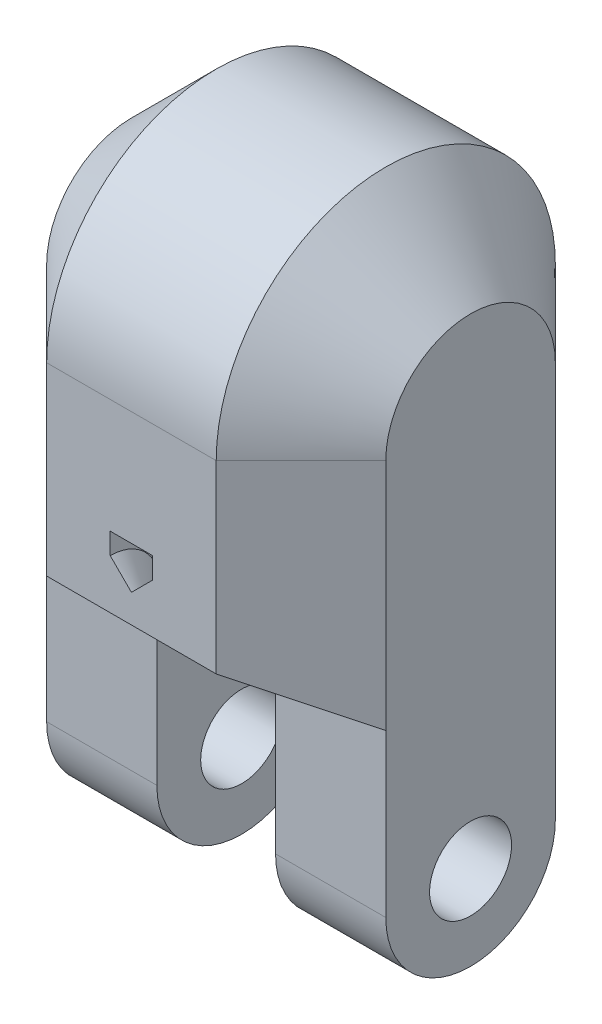
ISO-10303-21;
HEADER;
FILE_DESCRIPTION(('STEP AP214'),'2;1');
FILE_NAME('part.step','',(''),(''),'','','');
FILE_SCHEMA(('AUTOMOTIVE_DESIGN { 1 0 10303 214 1 1 1 1 }'));
ENDSEC;
DATA;
#1=APPLICATION_CONTEXT('core data for automotive mechanical design processes');
#2=APPLICATION_PROTOCOL_DEFINITION('international standard','automotive_design',2000,#1);
#3=PRODUCT_CONTEXT('',#1,'mechanical');
#4=PRODUCT('Part','Part','',(#3));
#5=PRODUCT_RELATED_PRODUCT_CATEGORY('part','',(#4));
#6=PRODUCT_DEFINITION_FORMATION('','',#4);
#7=PRODUCT_DEFINITION_CONTEXT('part definition',#1,'design');
#8=PRODUCT_DEFINITION('design','',#6,#7);
#9=PRODUCT_DEFINITION_SHAPE('','',#8);
#10=(LENGTH_UNIT() NAMED_UNIT(*) SI_UNIT(.MILLI.,.METRE.));
#11=(NAMED_UNIT(*) PLANE_ANGLE_UNIT() SI_UNIT($,.RADIAN.));
#12=(NAMED_UNIT(*) SI_UNIT($,.STERADIAN.) SOLID_ANGLE_UNIT());
#13=UNCERTAINTY_MEASURE_WITH_UNIT(LENGTH_MEASURE(1.E-05),#10,'distance_accuracy_value','');
#14=(GEOMETRIC_REPRESENTATION_CONTEXT(3) GLOBAL_UNCERTAINTY_ASSIGNED_CONTEXT((#13)) GLOBAL_UNIT_ASSIGNED_CONTEXT((#10,
#11,#12)) REPRESENTATION_CONTEXT('',''));
#15=CARTESIAN_POINT('',(0.,0.,0.));
#16=DIRECTION('',(0.,0.,1.));
#17=DIRECTION('',(1.,0.,0.));
#18=AXIS2_PLACEMENT_3D('',#15,#16,#17);
#19=CARTESIAN_POINT('',(-3.,5.,-6.));
#20=DIRECTION('',(0.,0.,-1.));
#21=DIRECTION('',(-1.,0.,0.));
#22=AXIS2_PLACEMENT_3D('',#19,#20,#21);
#23=PLANE('',#22);
#24=DIRECTION('',(0.,-1.,0.));
#25=VECTOR('',#24,1.);
#26=CARTESIAN_POINT('',(3.,5.,-6.));
#27=LINE('',#26,#25);
#28=CARTESIAN_POINT('',(3.,5.,-6.));
#29=VERTEX_POINT('',#28);
#30=CARTESIAN_POINT('',(3.,-8.7,-6.));
#31=VERTEX_POINT('',#30);
#32=EDGE_CURVE('E287',#29,#31,#27,.T.);
#33=ORIENTED_EDGE('',*,*,#32,.T.);
#34=DIRECTION('',(1.,0.,0.));
#35=VECTOR('',#34,1.);
#36=CARTESIAN_POINT('',(3.,-8.7,-6.));
#37=LINE('',#36,#35);
#38=CARTESIAN_POINT('',(-3.,-8.7,-6.));
#39=VERTEX_POINT('',#38);
#40=EDGE_CURVE('E492',#39,#31,#37,.T.);
#41=ORIENTED_EDGE('',*,*,#40,.F.);
#42=DIRECTION('',(0.,-1.,0.));
#43=VECTOR('',#42,1.);
#44=CARTESIAN_POINT('',(-3.,5.,-6.));
#45=LINE('',#44,#43);
#46=CARTESIAN_POINT('',(-3.,5.,-6.));
#47=VERTEX_POINT('',#46);
#48=EDGE_CURVE('E283',#47,#39,#45,.T.);
#49=ORIENTED_EDGE('',*,*,#48,.F.);
#50=DIRECTION('',(1.,0.,0.));
#51=VECTOR('',#50,1.);
#52=CARTESIAN_POINT('',(-3.,5.,-6.));
#53=LINE('',#52,#51);
#54=EDGE_CURVE('E321',#47,#29,#53,.T.);
#55=ORIENTED_EDGE('',*,*,#54,.T.);
#56=EDGE_LOOP('',(#33,#41,#49,#55));
#57=FACE_BOUND('',#56,.T.);
#58=DIRECTION('',(0.,1.,0.));
#59=VECTOR('',#58,1.);
#60=CARTESIAN_POINT('',(0.75,5.,-6.));
#61=LINE('',#60,#59);
#62=CARTESIAN_POINT('',(0.749999999999999,-7.7,-6.));
#63=VERTEX_POINT('',#62);
#64=CARTESIAN_POINT('',(0.75,-6.95,-6.));
#65=VERTEX_POINT('',#64);
#66=EDGE_CURVE('E513',#63,#65,#61,.T.);
#67=ORIENTED_EDGE('',*,*,#66,.T.);
#68=DIRECTION('',(0.707106781186548,-0.707106781186547,0.));
#69=VECTOR('',#68,1.);
#70=CARTESIAN_POINT('',(2.5,-8.7,-6.));
#71=LINE('',#70,#69);
#72=CARTESIAN_POINT('',(0.,-6.2,-6.));
#73=VERTEX_POINT('',#72);
#74=EDGE_CURVE('E223',#65,#73,#71,.F.);
#75=ORIENTED_EDGE('',*,*,#74,.T.);
#76=DIRECTION('',(0.707106781186547,0.707106781186548,0.));
#77=VECTOR('',#76,1.);
#78=CARTESIAN_POINT('',(-2.5,-8.7,-6.));
#79=LINE('',#78,#77);
#80=CARTESIAN_POINT('',(-0.75,-6.95,-6.));
#81=VERTEX_POINT('',#80);
#82=EDGE_CURVE('E501',#73,#81,#79,.F.);
#83=ORIENTED_EDGE('',*,*,#82,.T.);
#84=DIRECTION('',(0.,-1.,0.));
#85=VECTOR('',#84,1.);
#86=CARTESIAN_POINT('',(-0.75,5.,-6.));
#87=LINE('',#86,#85);
#88=CARTESIAN_POINT('',(-0.750000000000001,-7.7,-6.));
#89=VERTEX_POINT('',#88);
#90=EDGE_CURVE('E505',#81,#89,#87,.T.);
#91=ORIENTED_EDGE('',*,*,#90,.T.);
#92=DIRECTION('',(-1.,0.,0.));
#93=VECTOR('',#92,1.);
#94=CARTESIAN_POINT('',(-3.,-7.7,-6.));
#95=LINE('',#94,#93);
#96=EDGE_CURVE('E509',#89,#63,#95,.F.);
#97=ORIENTED_EDGE('',*,*,#96,.T.);
#98=EDGE_LOOP('',(#67,#75,#83,#91,#97));
#99=FACE_BOUND('',#98,.T.);
#100=ADVANCED_FACE('F39',(#57,#99),#23,.T.);
#101=CARTESIAN_POINT('',(0.,-8.7,0.));
#102=DIRECTION('',(0.,-1.,0.));
#103=DIRECTION('',(0.,0.,-1.));
#104=AXIS2_PLACEMENT_3D('',#101,#102,#103);
#105=PLANE('',#104);
#106=DIRECTION('',(0.707106781186548,0.,-0.707106781186548));
#107=VECTOR('',#106,1.);
#108=CARTESIAN_POINT('',(-3.,-8.7,-6.));
#109=LINE('',#108,#107);
#110=CARTESIAN_POINT('',(-6.,-8.7,-3.));
#111=VERTEX_POINT('',#110);
#112=EDGE_CURVE('E482',#111,#39,#109,.T.);
#113=ORIENTED_EDGE('',*,*,#112,.T.);
#114=ORIENTED_EDGE('',*,*,#40,.T.);
#115=DIRECTION('',(0.707106781186548,0.,0.707106781186548));
#116=VECTOR('',#115,1.);
#117=CARTESIAN_POINT('',(6.,-8.7,-3.));
#118=LINE('',#117,#116);
#119=CARTESIAN_POINT('',(6.,-8.7,-3.));
#120=VERTEX_POINT('',#119);
#121=EDGE_CURVE('E488',#31,#120,#118,.T.);
#122=ORIENTED_EDGE('',*,*,#121,.T.);
#123=DIRECTION('',(-1.,0.,0.));
#124=VECTOR('',#123,1.);
#125=CARTESIAN_POINT('',(2.1,-8.7,-3.));
#126=LINE('',#125,#124);
#127=CARTESIAN_POINT('',(2.1,-8.7,-3.));
#128=VERTEX_POINT('',#127);
#129=EDGE_CURVE('E477',#120,#128,#126,.T.);
#130=ORIENTED_EDGE('',*,*,#129,.T.);
#131=CARTESIAN_POINT('',(-2.1,-8.7,-3.));
#132=VERTEX_POINT('',#131);
#133=EDGE_CURVE('E486',#128,#132,#126,.T.);
#134=ORIENTED_EDGE('',*,*,#133,.T.);
#135=EDGE_CURVE('E487',#132,#111,#126,.T.);
#136=ORIENTED_EDGE('',*,*,#135,.T.);
#137=EDGE_LOOP('',(#113,#114,#122,#130,#134,#136));
#138=FACE_BOUND('',#137,.T.);
#139=DIRECTION('',(-0.707106781186547,0.,-0.707106781186548));
#140=VECTOR('',#139,1.);
#141=CARTESIAN_POINT('',(-2.5,-8.7,-6.));
#142=LINE('',#141,#140);
#143=CARTESIAN_POINT('',(-0.75,-8.7,-4.25));
#144=VERTEX_POINT('',#143);
#145=CARTESIAN_POINT('',(0.,-8.7,-3.5));
#146=VERTEX_POINT('',#145);
#147=EDGE_CURVE('E48',#144,#146,#142,.F.);
#148=ORIENTED_EDGE('',*,*,#147,.T.);
#149=DIRECTION('',(-0.707106781186548,0.,0.707106781186547));
#150=VECTOR('',#149,1.);
#151=CARTESIAN_POINT('',(2.5,-8.7,-6.));
#152=LINE('',#151,#150);
#153=CARTESIAN_POINT('',(0.75,-8.7,-4.25));
#154=VERTEX_POINT('',#153);
#155=EDGE_CURVE('E11',#146,#154,#152,.F.);
#156=ORIENTED_EDGE('',*,*,#155,.T.);
#157=DIRECTION('',(0.,0.,-1.));
#158=VECTOR('',#157,1.);
#159=CARTESIAN_POINT('',(0.75,-8.7,0.));
#160=LINE('',#159,#158);
#161=CARTESIAN_POINT('',(0.749999999999999,-8.7,-5.));
#162=VERTEX_POINT('',#161);
#163=EDGE_CURVE('E210',#154,#162,#160,.T.);
#164=ORIENTED_EDGE('',*,*,#163,.T.);
#165=DIRECTION('',(-1.,0.,0.));
#166=VECTOR('',#165,1.);
#167=CARTESIAN_POINT('',(-3.,-8.7,-5.));
#168=LINE('',#167,#166);
#169=CARTESIAN_POINT('',(-0.750000000000001,-8.7,-5.));
#170=VERTEX_POINT('',#169);
#171=EDGE_CURVE('E215',#162,#170,#168,.T.);
#172=ORIENTED_EDGE('',*,*,#171,.T.);
#173=DIRECTION('',(0.,0.,1.));
#174=VECTOR('',#173,1.);
#175=CARTESIAN_POINT('',(-0.75,-8.7,0.));
#176=LINE('',#175,#174);
#177=EDGE_CURVE('E230',#170,#144,#176,.T.);
#178=ORIENTED_EDGE('',*,*,#177,.T.);
#179=EDGE_LOOP('',(#148,#156,#164,#172,#178));
#180=FACE_BOUND('',#179,.T.);
#181=ADVANCED_FACE('F228',(#138,#180),#105,.T.);
#182=CARTESIAN_POINT('',(0.,-5.,0.));
#183=DIRECTION('',(0.,-1.,0.));
#184=DIRECTION('',(0.,0.,-1.));
#185=AXIS2_PLACEMENT_3D('',#182,#183,#184);
#186=PLANE('',#185);
#187=DIRECTION('',(0.,0.,-1.));
#188=VECTOR('',#187,1.);
#189=CARTESIAN_POINT('',(-2.1,-5.,0.));
#190=LINE('',#189,#188);
#191=CARTESIAN_POINT('',(-2.1,-5.,0.));
#192=VERTEX_POINT('',#191);
#193=CARTESIAN_POINT('',(-2.1,-5.,-3.));
#194=VERTEX_POINT('',#193);
#195=EDGE_CURVE('E356',#192,#194,#190,.T.);
#196=ORIENTED_EDGE('',*,*,#195,.T.);
#197=DIRECTION('',(-1.,0.,0.));
#198=VECTOR('',#197,1.);
#199=CARTESIAN_POINT('',(-6.,-5.,-3.));
#200=LINE('',#199,#198);
#201=CARTESIAN_POINT('',(2.1,-5.,-3.));
#202=VERTEX_POINT('',#201);
#203=EDGE_CURVE('E478',#202,#194,#200,.T.);
#204=ORIENTED_EDGE('',*,*,#203,.F.);
#205=DIRECTION('',(0.,0.,-1.));
#206=VECTOR('',#205,1.);
#207=CARTESIAN_POINT('',(2.1,-5.,0.));
#208=LINE('',#207,#206);
#209=CARTESIAN_POINT('',(2.1,-5.,0.));
#210=VERTEX_POINT('',#209);
#211=EDGE_CURVE('E271',#210,#202,#208,.T.);
#212=ORIENTED_EDGE('',*,*,#211,.F.);
#213=DIRECTION('',(1.,0.,0.));
#214=VECTOR('',#213,1.);
#215=CARTESIAN_POINT('',(-6.,-5.,0.));
#216=LINE('',#215,#214);
#217=EDGE_CURVE('E336',#192,#210,#216,.T.);
#218=ORIENTED_EDGE('',*,*,#217,.F.);
#219=EDGE_LOOP('',(#196,#204,#212,#218));
#220=FACE_BOUND('',#219,.T.);
#221=ADVANCED_FACE('F549',(#220),#186,.T.);
#222=CARTESIAN_POINT('',(-6.,-1.53589838486229,6.));
#223=DIRECTION('',(0.,0.866025403784442,-0.499999999999995));
#224=DIRECTION('',(0.,0.499999999999995,0.866025403784442));
#225=AXIS2_PLACEMENT_3D('',#222,#223,#224);
#226=PLANE('',#225);
#227=DIRECTION('',(-0.707106781186541,-0.353553390593273,-0.612372435695802));
#228=VECTOR('',#227,1.);
#229=CARTESIAN_POINT('',(0.999999999999979,-1.53589838486229,6.));
#230=LINE('',#229,#228);
#231=CARTESIAN_POINT('',(-0.749999999999986,-2.41089838486228,4.48445554337723));
#232=VERTEX_POINT('',#231);
#233=CARTESIAN_POINT('',(0.,-2.03589838486229,5.13397459621556));
#234=VERTEX_POINT('',#233);
#235=EDGE_CURVE('E438',#232,#234,#230,.F.);
#236=ORIENTED_EDGE('',*,*,#235,.T.);
#237=DIRECTION('',(-0.707106781186554,0.353553390593267,0.612372435695791));
#238=VECTOR('',#237,1.);
#239=CARTESIAN_POINT('',(-1.00000000000002,-1.53589838486229,6.));
#240=LINE('',#239,#238);
#241=CARTESIAN_POINT('',(0.750000000000014,-2.41089838486228,4.48445554337723));
#242=VERTEX_POINT('',#241);
#243=EDGE_CURVE('E261',#234,#242,#240,.F.);
#244=ORIENTED_EDGE('',*,*,#243,.T.);
#245=DIRECTION('',(0.,-0.499999999999995,-0.866025403784442));
#246=VECTOR('',#245,1.);
#247=CARTESIAN_POINT('',(0.750000000000014,-1.53589838486229,6.));
#248=LINE('',#247,#246);
#249=CARTESIAN_POINT('',(0.750000000000014,-2.78589838486228,3.8349364905389));
#250=VERTEX_POINT('',#249);
#251=EDGE_CURVE('E450',#242,#250,#248,.T.);
#252=ORIENTED_EDGE('',*,*,#251,.T.);
#253=DIRECTION('',(-1.,0.,0.));
#254=VECTOR('',#253,1.);
#255=CARTESIAN_POINT('',(-3.,-2.78589838486228,3.8349364905389));
#256=LINE('',#255,#254);
#257=CARTESIAN_POINT('',(-0.749999999999986,-2.78589838486228,3.8349364905389));
#258=VERTEX_POINT('',#257);
#259=EDGE_CURVE('E446',#250,#258,#256,.T.);
#260=ORIENTED_EDGE('',*,*,#259,.T.);
#261=DIRECTION('',(0.,0.499999999999995,0.866025403784442));
#262=VECTOR('',#261,1.);
#263=CARTESIAN_POINT('',(-0.749999999999986,-1.53589838486229,6.));
#264=LINE('',#263,#262);
#265=EDGE_CURVE('E442',#258,#232,#264,.T.);
#266=ORIENTED_EDGE('',*,*,#265,.T.);
#267=EDGE_LOOP('',(#236,#244,#252,#260,#266));
#268=FACE_BOUND('',#267,.T.);
#269=DIRECTION('',(0.,0.499999999999995,0.866025403784442));
#270=VECTOR('',#269,1.);
#271=CARTESIAN_POINT('',(2.1,-1.53589838486229,6.));
#272=LINE('',#271,#270);
#273=CARTESIAN_POINT('',(2.1,-3.26794919243115,3.));
#274=VERTEX_POINT('',#273);
#275=EDGE_CURVE('E255',#210,#274,#272,.T.);
#276=ORIENTED_EDGE('',*,*,#275,.T.);
#277=DIRECTION('',(1.,0.,0.));
#278=VECTOR('',#277,1.);
#279=CARTESIAN_POINT('',(-6.,-3.26794919243115,3.));
#280=LINE('',#279,#278);
#281=CARTESIAN_POINT('',(6.,-3.26794919243115,3.));
#282=VERTEX_POINT('',#281);
#283=EDGE_CURVE('E398',#274,#282,#280,.T.);
#284=ORIENTED_EDGE('',*,*,#283,.T.);
#285=DIRECTION('',(-0.654653670707978,0.377964473009223,0.654653670707978));
#286=VECTOR('',#285,1.);
#287=CARTESIAN_POINT('',(3.95421313204448,-2.08681359351244,5.04578686795552));
#288=LINE('',#287,#286);
#289=CARTESIAN_POINT('',(3.,-1.53589838486229,6.));
#290=VERTEX_POINT('',#289);
#291=EDGE_CURVE('E333',#282,#290,#288,.T.);
#292=ORIENTED_EDGE('',*,*,#291,.T.);
#293=DIRECTION('',(1.,0.,0.));
#294=VECTOR('',#293,1.);
#295=CARTESIAN_POINT('',(-6.,-1.53589838486229,6.));
#296=LINE('',#295,#294);
#297=CARTESIAN_POINT('',(-3.,-1.53589838486229,6.));
#298=VERTEX_POINT('',#297);
#299=EDGE_CURVE('E337',#298,#290,#296,.T.);
#300=ORIENTED_EDGE('',*,*,#299,.F.);
#301=DIRECTION('',(-0.654653670707978,-0.377964473009223,-0.654653670707979));
#302=VECTOR('',#301,1.);
#303=CARTESIAN_POINT('',(-1.38278456061589,-0.602198615596274,7.61721543938411));
#304=LINE('',#303,#302);
#305=CARTESIAN_POINT('',(-6.,-3.26794919243115,3.));
#306=VERTEX_POINT('',#305);
#307=EDGE_CURVE('E329',#298,#306,#304,.T.);
#308=ORIENTED_EDGE('',*,*,#307,.T.);
#309=DIRECTION('',(-1.,0.,0.));
#310=VECTOR('',#309,1.);
#311=CARTESIAN_POINT('',(-6.,-3.26794919243115,3.));
#312=LINE('',#311,#310);
#313=CARTESIAN_POINT('',(-2.1,-3.26794919243115,3.));
#314=VERTEX_POINT('',#313);
#315=EDGE_CURVE('E275',#314,#306,#312,.T.);
#316=ORIENTED_EDGE('',*,*,#315,.F.);
#317=DIRECTION('',(0.,0.499999999999995,0.866025403784442));
#318=VECTOR('',#317,1.);
#319=CARTESIAN_POINT('',(-2.1,-1.53589838486229,6.));
#320=LINE('',#319,#318);
#321=EDGE_CURVE('E265',#192,#314,#320,.T.);
#322=ORIENTED_EDGE('',*,*,#321,.F.);
#323=ORIENTED_EDGE('',*,*,#217,.T.);
#324=EDGE_LOOP('',(#276,#284,#292,#300,#308,#316,#322,#323));
#325=FACE_BOUND('',#324,.T.);
#326=ADVANCED_FACE('F593',(#268,#325),#226,.F.);
#327=CARTESIAN_POINT('',(-6.,5.,3.));
#328=DIRECTION('',(-1.,0.,0.));
#329=DIRECTION('',(0.,0.,1.));
#330=AXIS2_PLACEMENT_3D('',#327,#328,#329);
#331=PLANE('',#330);
#332=CARTESIAN_POINT('',(-6.,-9.,0.));
#333=DIRECTION('',(-1.,0.,0.));
#334=DIRECTION('',(0.,0.,1.));
#335=AXIS2_PLACEMENT_3D('',#332,#333,#334);
#336=CIRCLE('',#335,1.45);
#337=CARTESIAN_POINT('',(-6.,-9.,1.45));
#338=VERTEX_POINT('',#337);
#339=EDGE_CURVE('E270',#338,#338,#336,.T.);
#340=ORIENTED_EDGE('',*,*,#339,.F.);
#341=EDGE_LOOP('',(#340));
#342=FACE_BOUND('',#341,.T.);
#343=DIRECTION('',(0.,-1.,0.));
#344=VECTOR('',#343,1.);
#345=CARTESIAN_POINT('',(-6.,5.,-3.));
#346=LINE('',#345,#344);
#347=CARTESIAN_POINT('',(-6.,5.,-3.));
#348=VERTEX_POINT('',#347);
#349=EDGE_CURVE('E280',#348,#111,#346,.T.);
#350=ORIENTED_EDGE('',*,*,#349,.T.);
#351=DIRECTION('',(0.,1.,0.));
#352=VECTOR('',#351,1.);
#353=CARTESIAN_POINT('',(-6.,-9.,-3.));
#354=LINE('',#353,#352);
#355=CARTESIAN_POINT('',(-6.,-8.99999999999998,-3.));
#356=VERTEX_POINT('',#355);
#357=EDGE_CURVE('E360',#356,#111,#354,.T.);
#358=ORIENTED_EDGE('',*,*,#357,.F.);
#359=CARTESIAN_POINT('',(-6.,-9.,0.));
#360=DIRECTION('',(-1.,0.,0.));
#361=DIRECTION('',(0.,0.,1.));
#362=AXIS2_PLACEMENT_3D('',#359,#360,#361);
#363=CIRCLE('',#362,3.);
#364=CARTESIAN_POINT('',(-6.,-9.,3.));
#365=VERTEX_POINT('',#364);
#366=EDGE_CURVE('E388',#356,#365,#363,.T.);
#367=ORIENTED_EDGE('',*,*,#366,.T.);
#368=DIRECTION('',(0.,1.,0.));
#369=VECTOR('',#368,1.);
#370=CARTESIAN_POINT('',(-6.,-9.,3.));
#371=LINE('',#370,#369);
#372=EDGE_CURVE('E372',#365,#306,#371,.T.);
#373=ORIENTED_EDGE('',*,*,#372,.T.);
#374=DIRECTION('',(0.,-1.,0.));
#375=VECTOR('',#374,1.);
#376=CARTESIAN_POINT('',(-6.,5.,3.));
#377=LINE('',#376,#375);
#378=CARTESIAN_POINT('',(-6.,4.99999999999998,3.));
#379=VERTEX_POINT('',#378);
#380=EDGE_CURVE('E279',#379,#306,#377,.T.);
#381=ORIENTED_EDGE('',*,*,#380,.F.);
#382=CARTESIAN_POINT('',(-6.,5.,0.));
#383=DIRECTION('',(-1.,0.,0.));
#384=DIRECTION('',(0.,0.,1.));
#385=AXIS2_PLACEMENT_3D('',#382,#383,#384);
#386=CIRCLE('',#385,3.);
#387=EDGE_CURVE('E341',#379,#348,#386,.T.);
#388=ORIENTED_EDGE('',*,*,#387,.T.);
#389=EDGE_LOOP('',(#350,#358,#367,#373,#381,#388));
#390=FACE_BOUND('',#389,.T.);
#391=ADVANCED_FACE('F41',(#342,#390),#331,.T.);
#392=CARTESIAN_POINT('',(-3.,5.,6.));
#393=DIRECTION('',(-0.707106781186548,0.,0.707106781186547));
#394=DIRECTION('',(0.707106781186547,0.,0.707106781186548));
#395=AXIS2_PLACEMENT_3D('',#392,#393,#394);
#396=PLANE('',#395);
#397=ORIENTED_EDGE('',*,*,#307,.F.);
#398=DIRECTION('',(0.,-1.,0.));
#399=VECTOR('',#398,1.);
#400=CARTESIAN_POINT('',(-3.,5.,6.));
#401=LINE('',#400,#399);
#402=CARTESIAN_POINT('',(-3.,4.99999999999996,6.));
#403=VERTEX_POINT('',#402);
#404=EDGE_CURVE('E300',#403,#298,#401,.T.);
#405=ORIENTED_EDGE('',*,*,#404,.F.);
#406=DIRECTION('',(-0.707106781186547,0.,-0.707106781186548));
#407=VECTOR('',#406,1.);
#408=CARTESIAN_POINT('',(-3.,5.,6.));
#409=LINE('',#408,#407);
#410=EDGE_CURVE('E284',#403,#379,#409,.T.);
#411=ORIENTED_EDGE('',*,*,#410,.T.);
#412=ORIENTED_EDGE('',*,*,#380,.T.);
#413=EDGE_LOOP('',(#397,#405,#411,#412));
#414=FACE_BOUND('',#413,.T.);
#415=ADVANCED_FACE('F639',(#414),#396,.T.);
#416=CARTESIAN_POINT('',(3.,5.,6.));
#417=DIRECTION('',(0.,0.,1.));
#418=DIRECTION('',(1.,0.,0.));
#419=AXIS2_PLACEMENT_3D('',#416,#417,#418);
#420=PLANE('',#419);
#421=DIRECTION('',(-0.707106781186554,-0.707106781186541,0.));
#422=VECTOR('',#421,1.);
#423=CARTESIAN_POINT('',(-1.00000000000002,-1.53589838486229,6.));
#424=LINE('',#423,#422);
#425=CARTESIAN_POINT('',(0.,-0.535898384862296,6.));
#426=VERTEX_POINT('',#425);
#427=CARTESIAN_POINT('',(0.750000000000014,0.214101615137704,6.));
#428=VERTEX_POINT('',#427);
#429=EDGE_CURVE('E216',#426,#428,#424,.F.);
#430=ORIENTED_EDGE('',*,*,#429,.F.);
#431=DIRECTION('',(-0.707106781186541,0.707106781186554,0.));
#432=VECTOR('',#431,1.);
#433=CARTESIAN_POINT('',(0.999999999999979,-1.53589838486229,6.));
#434=LINE('',#433,#432);
#435=CARTESIAN_POINT('',(-0.749999999999986,0.214101615137704,6.));
#436=VERTEX_POINT('',#435);
#437=EDGE_CURVE('E243',#436,#426,#434,.F.);
#438=ORIENTED_EDGE('',*,*,#437,.F.);
#439=DIRECTION('',(0.,-1.,0.));
#440=VECTOR('',#439,1.);
#441=CARTESIAN_POINT('',(-0.749999999999986,5.,6.));
#442=LINE('',#441,#440);
#443=CARTESIAN_POINT('',(-0.749999999999986,0.964101615137704,6.));
#444=VERTEX_POINT('',#443);
#445=EDGE_CURVE('E246',#444,#436,#442,.T.);
#446=ORIENTED_EDGE('',*,*,#445,.F.);
#447=DIRECTION('',(-1.,0.,0.));
#448=VECTOR('',#447,1.);
#449=CARTESIAN_POINT('',(-3.,0.964101615137704,6.));
#450=LINE('',#449,#448);
#451=CARTESIAN_POINT('',(0.750000000000014,0.964101615137704,6.));
#452=VERTEX_POINT('',#451);
#453=EDGE_CURVE('E249',#452,#444,#450,.T.);
#454=ORIENTED_EDGE('',*,*,#453,.F.);
#455=DIRECTION('',(0.,1.,0.));
#456=VECTOR('',#455,1.);
#457=CARTESIAN_POINT('',(0.750000000000014,5.,6.));
#458=LINE('',#457,#456);
#459=EDGE_CURVE('E252',#428,#452,#458,.T.);
#460=ORIENTED_EDGE('',*,*,#459,.F.);
#461=EDGE_LOOP('',(#430,#438,#446,#454,#460));
#462=FACE_BOUND('',#461,.T.);
#463=ORIENTED_EDGE('',*,*,#299,.T.);
#464=DIRECTION('',(0.,-1.,0.));
#465=VECTOR('',#464,1.);
#466=CARTESIAN_POINT('',(3.,5.,6.));
#467=LINE('',#466,#465);
#468=CARTESIAN_POINT('',(3.,4.99999999999996,6.));
#469=VERTEX_POINT('',#468);
#470=EDGE_CURVE('E296',#469,#290,#467,.T.);
#471=ORIENTED_EDGE('',*,*,#470,.F.);
#472=DIRECTION('',(-1.,0.,0.));
#473=VECTOR('',#472,1.);
#474=CARTESIAN_POINT('',(3.,5.,6.));
#475=LINE('',#474,#473);
#476=EDGE_CURVE('E309',#469,#403,#475,.T.);
#477=ORIENTED_EDGE('',*,*,#476,.T.);
#478=ORIENTED_EDGE('',*,*,#404,.T.);
#479=EDGE_LOOP('',(#463,#471,#477,#478));
#480=FACE_BOUND('',#479,.T.);
#481=ADVANCED_FACE('F636',(#462,#480),#420,.T.);
#482=CARTESIAN_POINT('',(6.,5.,3.));
#483=DIRECTION('',(0.707106781186548,0.,0.707106781186548));
#484=DIRECTION('',(0.707106781186548,0.,-0.707106781186548));
#485=AXIS2_PLACEMENT_3D('',#482,#483,#484);
#486=PLANE('',#485);
#487=ORIENTED_EDGE('',*,*,#291,.F.);
#488=DIRECTION('',(0.,-1.,0.));
#489=VECTOR('',#488,1.);
#490=CARTESIAN_POINT('',(6.,5.,3.));
#491=LINE('',#490,#489);
#492=CARTESIAN_POINT('',(6.,5.,3.));
#493=VERTEX_POINT('',#492);
#494=EDGE_CURVE('E293',#493,#282,#491,.T.);
#495=ORIENTED_EDGE('',*,*,#494,.F.);
#496=DIRECTION('',(-0.707106781186547,0.,0.707106781186547));
#497=VECTOR('',#496,1.);
#498=CARTESIAN_POINT('',(6.,5.,3.));
#499=LINE('',#498,#497);
#500=EDGE_CURVE('E313',#493,#469,#499,.T.);
#501=ORIENTED_EDGE('',*,*,#500,.T.);
#502=ORIENTED_EDGE('',*,*,#470,.T.);
#503=EDGE_LOOP('',(#487,#495,#501,#502));
#504=FACE_BOUND('',#503,.T.);
#505=ADVANCED_FACE('F634',(#504),#486,.T.);
#506=CARTESIAN_POINT('',(6.,5.,-3.));
#507=DIRECTION('',(1.,0.,0.));
#508=DIRECTION('',(0.,0.,-1.));
#509=AXIS2_PLACEMENT_3D('',#506,#507,#508);
#510=PLANE('',#509);
#511=CARTESIAN_POINT('',(6.,-9.,0.));
#512=DIRECTION('',(1.,0.,0.));
#513=DIRECTION('',(0.,0.,-1.));
#514=AXIS2_PLACEMENT_3D('',#511,#512,#513);
#515=CIRCLE('',#514,1.45);
#516=CARTESIAN_POINT('',(6.,-9.,-1.45));
#517=VERTEX_POINT('',#516);
#518=EDGE_CURVE('E260',#517,#517,#515,.F.);
#519=ORIENTED_EDGE('',*,*,#518,.T.);
#520=EDGE_LOOP('',(#519));
#521=FACE_BOUND('',#520,.T.);
#522=ORIENTED_EDGE('',*,*,#494,.T.);
#523=DIRECTION('',(0.,1.,0.));
#524=VECTOR('',#523,1.);
#525=CARTESIAN_POINT('',(6.,-9.,3.));
#526=LINE('',#525,#524);
#527=CARTESIAN_POINT('',(6.,-9.,3.));
#528=VERTEX_POINT('',#527);
#529=EDGE_CURVE('E402',#528,#282,#526,.T.);
#530=ORIENTED_EDGE('',*,*,#529,.F.);
#531=CARTESIAN_POINT('',(6.,-9.,0.));
#532=DIRECTION('',(-1.,0.,0.));
#533=DIRECTION('',(0.,0.,1.));
#534=AXIS2_PLACEMENT_3D('',#531,#532,#533);
#535=CIRCLE('',#534,3.);
#536=CARTESIAN_POINT('',(6.,-9.,-3.));
#537=VERTEX_POINT('',#536);
#538=EDGE_CURVE('E429',#537,#528,#535,.T.);
#539=ORIENTED_EDGE('',*,*,#538,.F.);
#540=DIRECTION('',(0.,1.,0.));
#541=VECTOR('',#540,1.);
#542=CARTESIAN_POINT('',(6.,-9.,-3.));
#543=LINE('',#542,#541);
#544=EDGE_CURVE('E413',#537,#120,#543,.T.);
#545=ORIENTED_EDGE('',*,*,#544,.T.);
#546=DIRECTION('',(0.,-1.,0.));
#547=VECTOR('',#546,1.);
#548=CARTESIAN_POINT('',(6.,5.,-3.));
#549=LINE('',#548,#547);
#550=CARTESIAN_POINT('',(6.,5.,-3.));
#551=VERTEX_POINT('',#550);
#552=EDGE_CURVE('E290',#551,#120,#549,.T.);
#553=ORIENTED_EDGE('',*,*,#552,.F.);
#554=CARTESIAN_POINT('',(6.,5.,0.));
#555=DIRECTION('',(-1.,0.,0.));
#556=DIRECTION('',(0.,0.,1.));
#557=AXIS2_PLACEMENT_3D('',#554,#555,#556);
#558=CIRCLE('',#557,3.);
#559=EDGE_CURVE('E353',#493,#551,#558,.T.);
#560=ORIENTED_EDGE('',*,*,#559,.F.);
#561=EDGE_LOOP('',(#522,#530,#539,#545,#553,#560));
#562=FACE_BOUND('',#561,.T.);
#563=ADVANCED_FACE('F566',(#521,#562),#510,.T.);
#564=CARTESIAN_POINT('',(3.,5.,-6.));
#565=DIRECTION('',(0.707106781186547,0.,-0.707106781186548));
#566=DIRECTION('',(-0.707106781186548,0.,-0.707106781186547));
#567=AXIS2_PLACEMENT_3D('',#564,#565,#566);
#568=PLANE('',#567);
#569=ORIENTED_EDGE('',*,*,#552,.T.);
#570=ORIENTED_EDGE('',*,*,#121,.F.);
#571=ORIENTED_EDGE('',*,*,#32,.F.);
#572=DIRECTION('',(0.707106781186548,0.,0.707106781186547));
#573=VECTOR('',#572,1.);
#574=CARTESIAN_POINT('',(3.,5.,-6.));
#575=LINE('',#574,#573);
#576=EDGE_CURVE('E317',#29,#551,#575,.T.);
#577=ORIENTED_EDGE('',*,*,#576,.T.);
#578=EDGE_LOOP('',(#569,#570,#571,#577));
#579=FACE_BOUND('',#578,.T.);
#580=ADVANCED_FACE('F553',(#579),#568,.T.);
#581=CARTESIAN_POINT('',(-6.,5.,-3.));
#582=DIRECTION('',(-0.707106781186548,0.,-0.707106781186548));
#583=DIRECTION('',(-0.707106781186548,0.,0.707106781186548));
#584=AXIS2_PLACEMENT_3D('',#581,#582,#583);
#585=PLANE('',#584);
#586=ORIENTED_EDGE('',*,*,#48,.T.);
#587=ORIENTED_EDGE('',*,*,#112,.F.);
#588=ORIENTED_EDGE('',*,*,#349,.F.);
#589=DIRECTION('',(0.707106781186548,0.,-0.707106781186548));
#590=VECTOR('',#589,1.);
#591=CARTESIAN_POINT('',(-6.,5.,-3.));
#592=LINE('',#591,#590);
#593=EDGE_CURVE('E325',#348,#47,#592,.T.);
#594=ORIENTED_EDGE('',*,*,#593,.T.);
#595=EDGE_LOOP('',(#586,#587,#588,#594));
#596=FACE_BOUND('',#595,.T.);
#597=ADVANCED_FACE('F555',(#596),#585,.T.);
#598=CARTESIAN_POINT('',(-3.,5.,0.));
#599=DIRECTION('',(1.,0.,0.));
#600=DIRECTION('',(0.,0.,-1.));
#601=AXIS2_PLACEMENT_3D('',#598,#599,#600);
#602=CONICAL_SURFACE('',#601,6.,0.785398163397448);
#603=CARTESIAN_POINT('',(-3.,5.,0.));
#604=DIRECTION('',(-1.,0.,0.));
#605=DIRECTION('',(0.,0.,1.));
#606=AXIS2_PLACEMENT_3D('',#603,#604,#605);
#607=CIRCLE('',#606,6.);
#608=EDGE_CURVE('E347',#403,#47,#607,.T.);
#609=ORIENTED_EDGE('',*,*,#608,.T.);
#610=ORIENTED_EDGE('',*,*,#593,.F.);
#611=ORIENTED_EDGE('',*,*,#387,.F.);
#612=ORIENTED_EDGE('',*,*,#410,.F.);
#613=EDGE_LOOP('',(#609,#610,#611,#612));
#614=FACE_BOUND('',#613,.T.);
#615=ADVANCED_FACE('F557',(#614),#602,.T.);
#616=CARTESIAN_POINT('',(6.,5.,0.));
#617=DIRECTION('',(-1.,0.,0.));
#618=DIRECTION('',(0.,0.,1.));
#619=AXIS2_PLACEMENT_3D('',#616,#617,#618);
#620=CYLINDRICAL_SURFACE('',#619,6.);
#621=CARTESIAN_POINT('',(3.,5.,0.));
#622=DIRECTION('',(-1.,0.,0.));
#623=DIRECTION('',(0.,0.,1.));
#624=AXIS2_PLACEMENT_3D('',#621,#622,#623);
#625=CIRCLE('',#624,6.);
#626=EDGE_CURVE('E350',#469,#29,#625,.T.);
#627=ORIENTED_EDGE('',*,*,#626,.T.);
#628=ORIENTED_EDGE('',*,*,#54,.F.);
#629=ORIENTED_EDGE('',*,*,#608,.F.);
#630=ORIENTED_EDGE('',*,*,#476,.F.);
#631=EDGE_LOOP('',(#627,#628,#629,#630));
#632=FACE_BOUND('',#631,.T.);
#633=ADVANCED_FACE('F563',(#632),#620,.T.);
#634=CARTESIAN_POINT('',(6.,5.,0.));
#635=DIRECTION('',(-1.,0.,0.));
#636=DIRECTION('',(0.,0.,1.));
#637=AXIS2_PLACEMENT_3D('',#634,#635,#636);
#638=CONICAL_SURFACE('',#637,3.,0.785398163397448);
#639=ORIENTED_EDGE('',*,*,#559,.T.);
#640=ORIENTED_EDGE('',*,*,#576,.F.);
#641=ORIENTED_EDGE('',*,*,#626,.F.);
#642=ORIENTED_EDGE('',*,*,#500,.F.);
#643=EDGE_LOOP('',(#639,#640,#641,#642));
#644=FACE_BOUND('',#643,.T.);
#645=ADVANCED_FACE('F615',(#644),#638,.T.);
#646=CARTESIAN_POINT('',(-6.,-9.,3.));
#647=DIRECTION('',(0.,0.,-1.));
#648=DIRECTION('',(-1.,0.,0.));
#649=AXIS2_PLACEMENT_3D('',#646,#647,#648);
#650=PLANE('',#649);
#651=DIRECTION('',(0.,1.,0.));
#652=VECTOR('',#651,1.);
#653=CARTESIAN_POINT('',(-2.1,-9.,3.));
#654=LINE('',#653,#652);
#655=CARTESIAN_POINT('',(-2.1,-9.,3.));
#656=VERTEX_POINT('',#655);
#657=EDGE_CURVE('E368',#656,#314,#654,.T.);
#658=ORIENTED_EDGE('',*,*,#657,.T.);
#659=ORIENTED_EDGE('',*,*,#315,.T.);
#660=ORIENTED_EDGE('',*,*,#372,.F.);
#661=DIRECTION('',(-1.,0.,0.));
#662=VECTOR('',#661,1.);
#663=CARTESIAN_POINT('',(-6.,-9.,3.));
#664=LINE('',#663,#662);
#665=EDGE_CURVE('E376',#656,#365,#664,.T.);
#666=ORIENTED_EDGE('',*,*,#665,.F.);
#667=EDGE_LOOP('',(#658,#659,#660,#666));
#668=FACE_BOUND('',#667,.T.);
#669=ADVANCED_FACE('F599',(#668),#650,.F.);
#670=CARTESIAN_POINT('',(-6.,-9.,-3.));
#671=DIRECTION('',(0.,0.,1.));
#672=DIRECTION('',(1.,0.,0.));
#673=AXIS2_PLACEMENT_3D('',#670,#671,#672);
#674=PLANE('',#673);
#675=ORIENTED_EDGE('',*,*,#357,.T.);
#676=ORIENTED_EDGE('',*,*,#135,.F.);
#677=DIRECTION('',(0.,1.,0.));
#678=VECTOR('',#677,1.);
#679=CARTESIAN_POINT('',(-2.1,-9.,-3.));
#680=LINE('',#679,#678);
#681=CARTESIAN_POINT('',(-2.1,-9.,-3.));
#682=VERTEX_POINT('',#681);
#683=EDGE_CURVE('E364',#682,#132,#680,.T.);
#684=ORIENTED_EDGE('',*,*,#683,.F.);
#685=DIRECTION('',(1.,0.,0.));
#686=VECTOR('',#685,1.);
#687=CARTESIAN_POINT('',(-6.,-9.,-3.));
#688=LINE('',#687,#686);
#689=EDGE_CURVE('E380',#356,#682,#688,.T.);
#690=ORIENTED_EDGE('',*,*,#689,.F.);
#691=EDGE_LOOP('',(#675,#676,#684,#690));
#692=FACE_BOUND('',#691,.T.);
#693=ADVANCED_FACE('F604',(#692),#674,.F.);
#694=CARTESIAN_POINT('',(-2.1,-9.,-3.));
#695=DIRECTION('',(-1.,0.,0.));
#696=DIRECTION('',(0.,0.,1.));
#697=AXIS2_PLACEMENT_3D('',#694,#695,#696);
#698=PLANE('',#697);
#699=CARTESIAN_POINT('',(-2.1,-9.,0.));
#700=DIRECTION('',(-1.,0.,0.));
#701=DIRECTION('',(0.,0.,1.));
#702=AXIS2_PLACEMENT_3D('',#699,#700,#701);
#703=CIRCLE('',#702,1.45);
#704=CARTESIAN_POINT('',(-2.1,-9.,1.45));
#705=VERTEX_POINT('',#704);
#706=EDGE_CURVE('E266',#705,#705,#703,.T.);
#707=ORIENTED_EDGE('',*,*,#706,.T.);
#708=EDGE_LOOP('',(#707));
#709=FACE_BOUND('',#708,.T.);
#710=ORIENTED_EDGE('',*,*,#195,.F.);
#711=ORIENTED_EDGE('',*,*,#321,.T.);
#712=ORIENTED_EDGE('',*,*,#657,.F.);
#713=CARTESIAN_POINT('',(-2.1,-9.,0.));
#714=DIRECTION('',(-1.,0.,0.));
#715=DIRECTION('',(0.,0.,1.));
#716=AXIS2_PLACEMENT_3D('',#713,#714,#715);
#717=CIRCLE('',#716,3.);
#718=EDGE_CURVE('E384',#682,#656,#717,.T.);
#719=ORIENTED_EDGE('',*,*,#718,.F.);
#720=ORIENTED_EDGE('',*,*,#683,.T.);
#721=DIRECTION('',(0.,-1.,0.));
#722=VECTOR('',#721,1.);
#723=CARTESIAN_POINT('',(-2.1,-9.,-3.));
#724=LINE('',#723,#722);
#725=EDGE_CURVE('E473',#194,#132,#724,.T.);
#726=ORIENTED_EDGE('',*,*,#725,.F.);
#727=EDGE_LOOP('',(#710,#711,#712,#719,#720,#726));
#728=FACE_BOUND('',#727,.T.);
#729=ADVANCED_FACE('F595',(#709,#728),#698,.F.);
#730=CARTESIAN_POINT('',(-6.,-9.,0.));
#731=DIRECTION('',(-1.,0.,0.));
#732=DIRECTION('',(0.,0.,1.));
#733=AXIS2_PLACEMENT_3D('',#730,#731,#732);
#734=CYLINDRICAL_SURFACE('',#733,3.);
#735=ORIENTED_EDGE('',*,*,#366,.F.);
#736=ORIENTED_EDGE('',*,*,#689,.T.);
#737=ORIENTED_EDGE('',*,*,#718,.T.);
#738=ORIENTED_EDGE('',*,*,#665,.T.);
#739=EDGE_LOOP('',(#735,#736,#737,#738));
#740=FACE_BOUND('',#739,.T.);
#741=ADVANCED_FACE('F602',(#740),#734,.T.);
#742=CARTESIAN_POINT('',(6.,-9.,0.));
#743=DIRECTION('',(-1.,0.,0.));
#744=DIRECTION('',(0.,0.,1.));
#745=AXIS2_PLACEMENT_3D('',#742,#743,#744);
#746=CYLINDRICAL_SURFACE('',#745,1.45);
#747=ORIENTED_EDGE('',*,*,#339,.T.);
#748=EDGE_LOOP('',(#747));
#749=FACE_BOUND('',#748,.T.);
#750=ORIENTED_EDGE('',*,*,#706,.F.);
#751=EDGE_LOOP('',(#750));
#752=FACE_BOUND('',#751,.T.);
#753=ADVANCED_FACE('F673',(#749,#752),#746,.F.);
#754=CARTESIAN_POINT('',(6.,-9.,3.));
#755=DIRECTION('',(0.,0.,1.));
#756=DIRECTION('',(1.,0.,0.));
#757=AXIS2_PLACEMENT_3D('',#754,#755,#756);
#758=PLANE('',#757);
#759=ORIENTED_EDGE('',*,*,#283,.F.);
#760=DIRECTION('',(0.,1.,0.));
#761=VECTOR('',#760,1.);
#762=CARTESIAN_POINT('',(2.1,-9.,3.));
#763=LINE('',#762,#761);
#764=CARTESIAN_POINT('',(2.1,-9.,3.));
#765=VERTEX_POINT('',#764);
#766=EDGE_CURVE('E406',#765,#274,#763,.T.);
#767=ORIENTED_EDGE('',*,*,#766,.F.);
#768=DIRECTION('',(1.,0.,0.));
#769=VECTOR('',#768,1.);
#770=CARTESIAN_POINT('',(6.,-9.,3.));
#771=LINE('',#770,#769);
#772=EDGE_CURVE('E421',#765,#528,#771,.T.);
#773=ORIENTED_EDGE('',*,*,#772,.T.);
#774=ORIENTED_EDGE('',*,*,#529,.T.);
#775=EDGE_LOOP('',(#759,#767,#773,#774));
#776=FACE_BOUND('',#775,.T.);
#777=ADVANCED_FACE('F630',(#776),#758,.T.);
#778=CARTESIAN_POINT('',(2.1,-9.,-3.));
#779=DIRECTION('',(-1.,0.,0.));
#780=DIRECTION('',(0.,0.,1.));
#781=AXIS2_PLACEMENT_3D('',#778,#779,#780);
#782=PLANE('',#781);
#783=CARTESIAN_POINT('',(2.1,-9.,0.));
#784=DIRECTION('',(-1.,0.,0.));
#785=DIRECTION('',(0.,0.,1.));
#786=AXIS2_PLACEMENT_3D('',#783,#784,#785);
#787=CIRCLE('',#786,1.45);
#788=CARTESIAN_POINT('',(2.1,-9.,1.45));
#789=VERTEX_POINT('',#788);
#790=EDGE_CURVE('E256',#789,#789,#787,.F.);
#791=ORIENTED_EDGE('',*,*,#790,.T.);
#792=EDGE_LOOP('',(#791));
#793=FACE_BOUND('',#792,.T.);
#794=ORIENTED_EDGE('',*,*,#275,.F.);
#795=ORIENTED_EDGE('',*,*,#211,.T.);
#796=DIRECTION('',(0.,1.,0.));
#797=VECTOR('',#796,1.);
#798=CARTESIAN_POINT('',(2.1,-9.,-3.));
#799=LINE('',#798,#797);
#800=EDGE_CURVE('E412',#128,#202,#799,.T.);
#801=ORIENTED_EDGE('',*,*,#800,.F.);
#802=CARTESIAN_POINT('',(2.1,-8.99999999999998,-3.));
#803=VERTEX_POINT('',#802);
#804=EDGE_CURVE('E409',#803,#128,#799,.T.);
#805=ORIENTED_EDGE('',*,*,#804,.F.);
#806=CARTESIAN_POINT('',(2.1,-9.,0.));
#807=DIRECTION('',(-1.,0.,0.));
#808=DIRECTION('',(0.,0.,1.));
#809=AXIS2_PLACEMENT_3D('',#806,#807,#808);
#810=CIRCLE('',#809,3.);
#811=EDGE_CURVE('E425',#803,#765,#810,.T.);
#812=ORIENTED_EDGE('',*,*,#811,.T.);
#813=ORIENTED_EDGE('',*,*,#766,.T.);
#814=EDGE_LOOP('',(#794,#795,#801,#805,#812,#813));
#815=FACE_BOUND('',#814,.T.);
#816=ADVANCED_FACE('F587',(#793,#815),#782,.T.);
#817=CARTESIAN_POINT('',(6.,-9.,-3.));
#818=DIRECTION('',(0.,0.,-1.));
#819=DIRECTION('',(-1.,0.,0.));
#820=AXIS2_PLACEMENT_3D('',#817,#818,#819);
#821=PLANE('',#820);
#822=ORIENTED_EDGE('',*,*,#129,.F.);
#823=ORIENTED_EDGE('',*,*,#544,.F.);
#824=DIRECTION('',(-1.,0.,0.));
#825=VECTOR('',#824,1.);
#826=CARTESIAN_POINT('',(6.,-9.,-3.));
#827=LINE('',#826,#825);
#828=EDGE_CURVE('E417',#537,#803,#827,.T.);
#829=ORIENTED_EDGE('',*,*,#828,.T.);
#830=ORIENTED_EDGE('',*,*,#804,.T.);
#831=EDGE_LOOP('',(#822,#823,#829,#830));
#832=FACE_BOUND('',#831,.T.);
#833=ADVANCED_FACE('F621',(#832),#821,.T.);
#834=CARTESIAN_POINT('',(6.,-9.,0.));
#835=DIRECTION('',(1.,0.,0.));
#836=DIRECTION('',(0.,0.,1.));
#837=AXIS2_PLACEMENT_3D('',#834,#835,#836);
#838=CYLINDRICAL_SURFACE('',#837,3.);
#839=ORIENTED_EDGE('',*,*,#538,.T.);
#840=ORIENTED_EDGE('',*,*,#772,.F.);
#841=ORIENTED_EDGE('',*,*,#811,.F.);
#842=ORIENTED_EDGE('',*,*,#828,.F.);
#843=EDGE_LOOP('',(#839,#840,#841,#842));
#844=FACE_BOUND('',#843,.T.);
#845=ADVANCED_FACE('F626',(#844),#838,.T.);
#846=CARTESIAN_POINT('',(-6.,-9.,0.));
#847=DIRECTION('',(1.,0.,0.));
#848=DIRECTION('',(0.,0.,-1.));
#849=AXIS2_PLACEMENT_3D('',#846,#847,#848);
#850=CYLINDRICAL_SURFACE('',#849,1.45);
#851=ORIENTED_EDGE('',*,*,#518,.F.);
#852=EDGE_LOOP('',(#851));
#853=FACE_BOUND('',#852,.T.);
#854=ORIENTED_EDGE('',*,*,#790,.F.);
#855=EDGE_LOOP('',(#854));
#856=FACE_BOUND('',#855,.T.);
#857=ADVANCED_FACE('F659',(#853,#856),#850,.F.);
#858=CARTESIAN_POINT('',(0.750000000000014,-1.53589838486229,6.));
#859=DIRECTION('',(1.,0.,0.));
#860=DIRECTION('',(0.,0.,-1.));
#861=AXIS2_PLACEMENT_3D('',#858,#859,#860);
#862=CONICAL_SURFACE('',#861,1.75,0.785398163397439);
#863=CARTESIAN_POINT('',(0.,-1.53589838486229,6.));
#864=DIRECTION('',(-1.,0.,0.));
#865=DIRECTION('',(0.,0.,1.));
#866=AXIS2_PLACEMENT_3D('',#863,#864,#865);
#867=CIRCLE('',#866,0.999999999999998);
#868=EDGE_CURVE('E454',#426,#234,#867,.T.);
#869=ORIENTED_EDGE('',*,*,#868,.F.);
#870=ORIENTED_EDGE('',*,*,#429,.T.);
#871=CARTESIAN_POINT('',(0.750000000000014,-1.53589838486229,6.));
#872=DIRECTION('',(-1.,0.,0.));
#873=DIRECTION('',(0.,0.,1.));
#874=AXIS2_PLACEMENT_3D('',#871,#872,#873);
#875=CIRCLE('',#874,1.75);
#876=EDGE_CURVE('E469',#428,#242,#875,.T.);
#877=ORIENTED_EDGE('',*,*,#876,.T.);
#878=ORIENTED_EDGE('',*,*,#243,.F.);
#879=EDGE_LOOP('',(#869,#870,#877,#878));
#880=FACE_BOUND('',#879,.T.);
#881=ADVANCED_FACE('F662',(#880),#862,.T.);
#882=CARTESIAN_POINT('',(0.,-1.53589838486229,6.));
#883=DIRECTION('',(-1.,0.,0.));
#884=DIRECTION('',(0.,0.,1.));
#885=AXIS2_PLACEMENT_3D('',#882,#883,#884);
#886=CONICAL_SURFACE('',#885,0.999999999999998,0.785398163397458);
#887=CARTESIAN_POINT('',(-0.749999999999986,-1.53589838486229,6.));
#888=DIRECTION('',(-1.,0.,0.));
#889=DIRECTION('',(0.,0.,1.));
#890=AXIS2_PLACEMENT_3D('',#887,#888,#889);
#891=CIRCLE('',#890,1.75);
#892=EDGE_CURVE('E458',#436,#232,#891,.T.);
#893=ORIENTED_EDGE('',*,*,#892,.F.);
#894=ORIENTED_EDGE('',*,*,#437,.T.);
#895=ORIENTED_EDGE('',*,*,#868,.T.);
#896=ORIENTED_EDGE('',*,*,#235,.F.);
#897=EDGE_LOOP('',(#893,#894,#895,#896));
#898=FACE_BOUND('',#897,.T.);
#899=ADVANCED_FACE('F699',(#898),#886,.T.);
#900=CARTESIAN_POINT('',(-0.749999999999986,-2.41089838486228,4.48445554337723));
#901=DIRECTION('',(-1.,0.,0.));
#902=DIRECTION('',(0.,0.,1.));
#903=AXIS2_PLACEMENT_3D('',#900,#901,#902);
#904=PLANE('',#903);
#905=CARTESIAN_POINT('',(-0.749999999999986,-1.53589838486229,6.));
#906=DIRECTION('',(-1.,0.,0.));
#907=DIRECTION('',(0.,0.,1.));
#908=AXIS2_PLACEMENT_3D('',#905,#906,#907);
#909=CIRCLE('',#908,2.5);
#910=EDGE_CURVE('E462',#444,#258,#909,.T.);
#911=ORIENTED_EDGE('',*,*,#910,.F.);
#912=ORIENTED_EDGE('',*,*,#445,.T.);
#913=ORIENTED_EDGE('',*,*,#892,.T.);
#914=ORIENTED_EDGE('',*,*,#265,.F.);
#915=EDGE_LOOP('',(#911,#912,#913,#914));
#916=FACE_BOUND('',#915,.T.);
#917=ADVANCED_FACE('F704',(#916),#904,.F.);
#918=CARTESIAN_POINT('',(-3.,-1.53589838486229,6.));
#919=DIRECTION('',(-1.,0.,0.));
#920=DIRECTION('',(0.,0.,1.));
#921=AXIS2_PLACEMENT_3D('',#918,#919,#920);
#922=CYLINDRICAL_SURFACE('',#921,2.5);
#923=CARTESIAN_POINT('',(0.750000000000014,-1.53589838486229,6.));
#924=DIRECTION('',(-1.,0.,0.));
#925=DIRECTION('',(0.,0.,1.));
#926=AXIS2_PLACEMENT_3D('',#923,#924,#925);
#927=CIRCLE('',#926,2.5);
#928=EDGE_CURVE('E466',#452,#250,#927,.T.);
#929=ORIENTED_EDGE('',*,*,#928,.F.);
#930=ORIENTED_EDGE('',*,*,#453,.T.);
#931=ORIENTED_EDGE('',*,*,#910,.T.);
#932=ORIENTED_EDGE('',*,*,#259,.F.);
#933=EDGE_LOOP('',(#929,#930,#931,#932));
#934=FACE_BOUND('',#933,.T.);
#935=ADVANCED_FACE('F715',(#934),#922,.F.);
#936=CARTESIAN_POINT('',(0.750000000000014,-2.78589838486228,3.8349364905389));
#937=DIRECTION('',(1.,0.,0.));
#938=DIRECTION('',(0.,0.,-1.));
#939=AXIS2_PLACEMENT_3D('',#936,#937,#938);
#940=PLANE('',#939);
#941=ORIENTED_EDGE('',*,*,#876,.F.);
#942=ORIENTED_EDGE('',*,*,#459,.T.);
#943=ORIENTED_EDGE('',*,*,#928,.T.);
#944=ORIENTED_EDGE('',*,*,#251,.F.);
#945=EDGE_LOOP('',(#941,#942,#943,#944));
#946=FACE_BOUND('',#945,.T.);
#947=ADVANCED_FACE('F711',(#946),#940,.F.);
#948=CARTESIAN_POINT('',(-6.,-8.7,-3.));
#949=DIRECTION('',(0.,0.,-1.));
#950=DIRECTION('',(-1.,0.,0.));
#951=AXIS2_PLACEMENT_3D('',#948,#949,#950);
#952=PLANE('',#951);
#953=ORIENTED_EDGE('',*,*,#203,.T.);
#954=ORIENTED_EDGE('',*,*,#725,.T.);
#955=ORIENTED_EDGE('',*,*,#133,.F.);
#956=ORIENTED_EDGE('',*,*,#800,.T.);
#957=EDGE_LOOP('',(#953,#954,#955,#956));
#958=FACE_BOUND('',#957,.T.);
#959=ADVANCED_FACE('F541',(#958),#952,.F.);
#960=CARTESIAN_POINT('',(0.75,-8.7,-6.));
#961=DIRECTION('',(-1.,0.,0.));
#962=DIRECTION('',(0.,0.,1.));
#963=AXIS2_PLACEMENT_3D('',#960,#961,#962);
#964=CONICAL_SURFACE('',#963,1.75,0.785398163397448);
#965=CARTESIAN_POINT('',(0.75,-8.7,-6.));
#966=DIRECTION('',(-1.,0.,0.));
#967=DIRECTION('',(0.,0.,1.));
#968=AXIS2_PLACEMENT_3D('',#965,#966,#967);
#969=CIRCLE('',#968,1.75);
#970=EDGE_CURVE('E55',#154,#65,#969,.T.);
#971=ORIENTED_EDGE('',*,*,#970,.F.);
#972=ORIENTED_EDGE('',*,*,#155,.F.);
#973=CARTESIAN_POINT('',(0.,-8.7,-6.));
#974=DIRECTION('',(-1.,0.,0.));
#975=DIRECTION('',(0.,0.,1.));
#976=AXIS2_PLACEMENT_3D('',#973,#974,#975);
#977=CIRCLE('',#976,2.5);
#978=EDGE_CURVE('E516',#146,#73,#977,.T.);
#979=ORIENTED_EDGE('',*,*,#978,.T.);
#980=ORIENTED_EDGE('',*,*,#74,.F.);
#981=EDGE_LOOP('',(#971,#972,#979,#980));
#982=FACE_BOUND('',#981,.T.);
#983=ADVANCED_FACE('F219',(#982),#964,.F.);
#984=CARTESIAN_POINT('',(0.,-8.7,-6.));
#985=DIRECTION('',(1.,0.,0.));
#986=DIRECTION('',(0.,0.,-1.));
#987=AXIS2_PLACEMENT_3D('',#984,#985,#986);
#988=CONICAL_SURFACE('',#987,2.5,0.785398163397449);
#989=ORIENTED_EDGE('',*,*,#978,.F.);
#990=ORIENTED_EDGE('',*,*,#147,.F.);
#991=CARTESIAN_POINT('',(-0.75,-8.7,-6.));
#992=DIRECTION('',(-1.,0.,0.));
#993=DIRECTION('',(0.,0.,1.));
#994=AXIS2_PLACEMENT_3D('',#991,#992,#993);
#995=CIRCLE('',#994,1.75);
#996=EDGE_CURVE('E519',#144,#81,#995,.T.);
#997=ORIENTED_EDGE('',*,*,#996,.T.);
#998=ORIENTED_EDGE('',*,*,#82,.F.);
#999=EDGE_LOOP('',(#989,#990,#997,#998));
#1000=FACE_BOUND('',#999,.T.);
#1001=ADVANCED_FACE('F533',(#1000),#988,.F.);
#1002=CARTESIAN_POINT('',(-0.75,-8.7,-4.25));
#1003=DIRECTION('',(1.,0.,0.));
#1004=DIRECTION('',(0.,0.,-1.));
#1005=AXIS2_PLACEMENT_3D('',#1002,#1003,#1004);
#1006=PLANE('',#1005);
#1007=ORIENTED_EDGE('',*,*,#996,.F.);
#1008=ORIENTED_EDGE('',*,*,#177,.F.);
#1009=CARTESIAN_POINT('',(-0.750000000000001,-8.7,-6.));
#1010=DIRECTION('',(-1.,0.,0.));
#1011=DIRECTION('',(0.,0.,1.));
#1012=AXIS2_PLACEMENT_3D('',#1009,#1010,#1011);
#1013=CIRCLE('',#1012,1.);
#1014=EDGE_CURVE('E522',#170,#89,#1013,.T.);
#1015=ORIENTED_EDGE('',*,*,#1014,.T.);
#1016=ORIENTED_EDGE('',*,*,#90,.F.);
#1017=EDGE_LOOP('',(#1007,#1008,#1015,#1016));
#1018=FACE_BOUND('',#1017,.T.);
#1019=ADVANCED_FACE('F532',(#1018),#1006,.T.);
#1020=CARTESIAN_POINT('',(-3.,-8.7,-6.));
#1021=DIRECTION('',(-1.,0.,0.));
#1022=DIRECTION('',(0.,0.,1.));
#1023=AXIS2_PLACEMENT_3D('',#1020,#1021,#1022);
#1024=CYLINDRICAL_SURFACE('',#1023,1.);
#1025=ORIENTED_EDGE('',*,*,#1014,.F.);
#1026=ORIENTED_EDGE('',*,*,#171,.F.);
#1027=CARTESIAN_POINT('',(0.749999999999999,-8.7,-6.));
#1028=DIRECTION('',(-1.,0.,0.));
#1029=DIRECTION('',(0.,0.,1.));
#1030=AXIS2_PLACEMENT_3D('',#1027,#1028,#1029);
#1031=CIRCLE('',#1030,1.);
#1032=EDGE_CURVE('E60',#162,#63,#1031,.T.);
#1033=ORIENTED_EDGE('',*,*,#1032,.T.);
#1034=ORIENTED_EDGE('',*,*,#96,.F.);
#1035=EDGE_LOOP('',(#1025,#1026,#1033,#1034));
#1036=FACE_BOUND('',#1035,.T.);
#1037=ADVANCED_FACE('F529',(#1036),#1024,.T.);
#1038=CARTESIAN_POINT('',(0.75,-8.7,-5.));
#1039=DIRECTION('',(-1.,0.,0.));
#1040=DIRECTION('',(0.,0.,1.));
#1041=AXIS2_PLACEMENT_3D('',#1038,#1039,#1040);
#1042=PLANE('',#1041);
#1043=ORIENTED_EDGE('',*,*,#1032,.F.);
#1044=ORIENTED_EDGE('',*,*,#163,.F.);
#1045=ORIENTED_EDGE('',*,*,#970,.T.);
#1046=ORIENTED_EDGE('',*,*,#66,.F.);
#1047=EDGE_LOOP('',(#1043,#1044,#1045,#1046));
#1048=FACE_BOUND('',#1047,.T.);
#1049=ADVANCED_FACE('F211',(#1048),#1042,.T.);
#1050=CLOSED_SHELL('',(#100,#181,#221,#326,#391,#415,#481,#505,#563,#580,#597,#615,#633,#645,
#669,#693,#729,#741,#753,#777,#816,#833,#845,#857,#881,#899,#917,#935,#947,#959,#983,#1001,
#1019,#1037,#1049));
#1051=MANIFOLD_SOLID_BREP('B2',#1050);
#1052=ADVANCED_BREP_SHAPE_REPRESENTATION('',(#18,#1051),#14);
#1053=SHAPE_DEFINITION_REPRESENTATION(#9,#1052);
ENDSEC;
END-ISO-10303-21;
